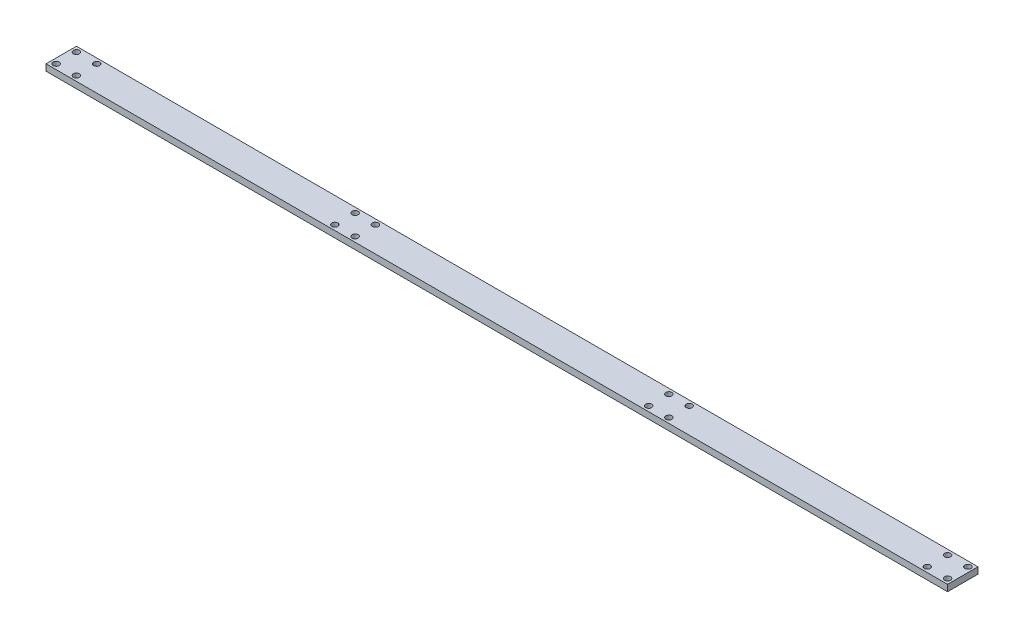
ISO-10303-21;
HEADER;
FILE_DESCRIPTION(('STEP AP214'),'2;1');
FILE_NAME('part.step','',(''),(''),'','','');
FILE_SCHEMA(('AUTOMOTIVE_DESIGN { 1 0 10303 214 1 1 1 1 }'));
ENDSEC;
DATA;
#1=APPLICATION_CONTEXT('core data for automotive mechanical design processes');
#2=APPLICATION_PROTOCOL_DEFINITION('international standard','automotive_design',2000,#1);
#3=PRODUCT_CONTEXT('',#1,'mechanical');
#4=PRODUCT('Part','Part','',(#3));
#5=PRODUCT_RELATED_PRODUCT_CATEGORY('part','',(#4));
#6=PRODUCT_DEFINITION_FORMATION('','',#4);
#7=PRODUCT_DEFINITION_CONTEXT('part definition',#1,'design');
#8=PRODUCT_DEFINITION('design','',#6,#7);
#9=PRODUCT_DEFINITION_SHAPE('','',#8);
#10=(LENGTH_UNIT() NAMED_UNIT(*) SI_UNIT(.MILLI.,.METRE.));
#11=(NAMED_UNIT(*) PLANE_ANGLE_UNIT() SI_UNIT($,.RADIAN.));
#12=(NAMED_UNIT(*) SI_UNIT($,.STERADIAN.) SOLID_ANGLE_UNIT());
#13=UNCERTAINTY_MEASURE_WITH_UNIT(LENGTH_MEASURE(1.E-05),#10,'distance_accuracy_value','');
#14=(GEOMETRIC_REPRESENTATION_CONTEXT(3) GLOBAL_UNCERTAINTY_ASSIGNED_CONTEXT((#13)) GLOBAL_UNIT_ASSIGNED_CONTEXT((#10,
#11,#12)) REPRESENTATION_CONTEXT('',''));
#15=CARTESIAN_POINT('',(0.,0.,0.));
#16=DIRECTION('',(0.,0.,1.));
#17=DIRECTION('',(1.,0.,0.));
#18=AXIS2_PLACEMENT_3D('',#15,#16,#17);
#19=CARTESIAN_POINT('',(0.,3.175,-15.));
#20=DIRECTION('',(0.,0.,-1.));
#21=DIRECTION('',(-1.,0.,0.));
#22=AXIS2_PLACEMENT_3D('',#19,#20,#21);
#23=PLANE('',#22);
#24=DIRECTION('',(1.,0.,0.));
#25=VECTOR('',#24,1.);
#26=CARTESIAN_POINT('',(0.,0.,-15.));
#27=LINE('',#26,#25);
#28=CARTESIAN_POINT('',(0.,0.,-15.));
#29=VERTEX_POINT('',#28);
#30=CARTESIAN_POINT('',(444.5,0.,-15.));
#31=VERTEX_POINT('',#30);
#32=EDGE_CURVE('E178',#29,#31,#27,.T.);
#33=ORIENTED_EDGE('',*,*,#32,.F.);
#34=DIRECTION('',(0.,-1.,0.));
#35=VECTOR('',#34,1.);
#36=CARTESIAN_POINT('',(0.,3.175,-15.));
#37=LINE('',#36,#35);
#38=CARTESIAN_POINT('',(0.,3.175,-15.));
#39=VERTEX_POINT('',#38);
#40=EDGE_CURVE('E11',#39,#29,#37,.T.);
#41=ORIENTED_EDGE('',*,*,#40,.F.);
#42=DIRECTION('',(1.,0.,0.));
#43=VECTOR('',#42,1.);
#44=CARTESIAN_POINT('',(0.,3.175,-15.));
#45=LINE('',#44,#43);
#46=CARTESIAN_POINT('',(444.5,3.175,-15.));
#47=VERTEX_POINT('',#46);
#48=EDGE_CURVE('E104',#39,#47,#45,.T.);
#49=ORIENTED_EDGE('',*,*,#48,.T.);
#50=DIRECTION('',(0.,-1.,0.));
#51=VECTOR('',#50,1.);
#52=CARTESIAN_POINT('',(444.5,3.175,-15.));
#53=LINE('',#52,#51);
#54=EDGE_CURVE('E80',#47,#31,#53,.T.);
#55=ORIENTED_EDGE('',*,*,#54,.T.);
#56=EDGE_LOOP('',(#33,#41,#49,#55));
#57=FACE_BOUND('',#56,.T.);
#58=ADVANCED_FACE('F39',(#57),#23,.T.);
#59=CARTESIAN_POINT('',(0.,3.175,0.));
#60=DIRECTION('',(-1.,0.,0.));
#61=DIRECTION('',(0.,0.,1.));
#62=AXIS2_PLACEMENT_3D('',#59,#60,#61);
#63=PLANE('',#62);
#64=DIRECTION('',(0.,0.,-1.));
#65=VECTOR('',#64,1.);
#66=CARTESIAN_POINT('',(0.,0.,0.));
#67=LINE('',#66,#65);
#68=CARTESIAN_POINT('',(0.,0.,0.));
#69=VERTEX_POINT('',#68);
#70=EDGE_CURVE('E92',#69,#29,#67,.T.);
#71=ORIENTED_EDGE('',*,*,#70,.F.);
#72=DIRECTION('',(0.,-1.,0.));
#73=VECTOR('',#72,1.);
#74=CARTESIAN_POINT('',(0.,3.175,0.));
#75=LINE('',#74,#73);
#76=CARTESIAN_POINT('',(0.,3.175,0.));
#77=VERTEX_POINT('',#76);
#78=EDGE_CURVE('E49',#77,#69,#75,.T.);
#79=ORIENTED_EDGE('',*,*,#78,.F.);
#80=DIRECTION('',(0.,0.,-1.));
#81=VECTOR('',#80,1.);
#82=CARTESIAN_POINT('',(0.,3.175,0.));
#83=LINE('',#82,#81);
#84=EDGE_CURVE('E90',#77,#39,#83,.T.);
#85=ORIENTED_EDGE('',*,*,#84,.T.);
#86=ORIENTED_EDGE('',*,*,#40,.T.);
#87=EDGE_LOOP('',(#71,#79,#85,#86));
#88=FACE_BOUND('',#87,.T.);
#89=ADVANCED_FACE('F88',(#88),#63,.T.);
#90=CARTESIAN_POINT('',(0.,3.175,0.));
#91=DIRECTION('',(0.,0.,-1.));
#92=DIRECTION('',(-1.,0.,0.));
#93=AXIS2_PLACEMENT_3D('',#90,#91,#92);
#94=PLANE('',#93);
#95=DIRECTION('',(1.,0.,0.));
#96=VECTOR('',#95,1.);
#97=CARTESIAN_POINT('',(0.,0.,0.));
#98=LINE('',#97,#96);
#99=CARTESIAN_POINT('',(444.5,0.,0.));
#100=VERTEX_POINT('',#99);
#101=EDGE_CURVE('E183',#69,#100,#98,.T.);
#102=ORIENTED_EDGE('',*,*,#101,.T.);
#103=DIRECTION('',(0.,-1.,0.));
#104=VECTOR('',#103,1.);
#105=CARTESIAN_POINT('',(444.5,3.175,0.));
#106=LINE('',#105,#104);
#107=CARTESIAN_POINT('',(444.5,3.175,0.));
#108=VERTEX_POINT('',#107);
#109=EDGE_CURVE('E96',#108,#100,#106,.T.);
#110=ORIENTED_EDGE('',*,*,#109,.F.);
#111=DIRECTION('',(1.,0.,0.));
#112=VECTOR('',#111,1.);
#113=CARTESIAN_POINT('',(0.,3.175,0.));
#114=LINE('',#113,#112);
#115=EDGE_CURVE('E98',#77,#108,#114,.T.);
#116=ORIENTED_EDGE('',*,*,#115,.F.);
#117=ORIENTED_EDGE('',*,*,#78,.T.);
#118=EDGE_LOOP('',(#102,#110,#116,#117));
#119=FACE_BOUND('',#118,.T.);
#120=ADVANCED_FACE('F99',(#119),#94,.F.);
#121=CARTESIAN_POINT('',(442.,3.175,-12.5));
#122=DIRECTION('',(0.,-1.,0.));
#123=DIRECTION('',(0.,0.,-1.));
#124=AXIS2_PLACEMENT_3D('',#121,#122,#123);
#125=CYLINDRICAL_SURFACE('',#124,1.49999999999997);
#126=CARTESIAN_POINT('',(442.,3.175,-12.5));
#127=DIRECTION('',(0.,1.,0.));
#128=DIRECTION('',(0.,0.,1.));
#129=AXIS2_PLACEMENT_3D('',#126,#127,#128);
#130=CIRCLE('',#129,1.49999999999997);
#131=CARTESIAN_POINT('',(442.,3.175,-11.));
#132=VERTEX_POINT('',#131);
#133=EDGE_CURVE('E154',#132,#132,#130,.F.);
#134=ORIENTED_EDGE('',*,*,#133,.F.);
#135=EDGE_LOOP('',(#134));
#136=FACE_BOUND('',#135,.T.);
#137=CARTESIAN_POINT('',(442.,0.,-12.5));
#138=DIRECTION('',(0.,1.,0.));
#139=DIRECTION('',(0.,0.,1.));
#140=AXIS2_PLACEMENT_3D('',#137,#138,#139);
#141=CIRCLE('',#140,1.49999999999997);
#142=CARTESIAN_POINT('',(442.,0.,-11.));
#143=VERTEX_POINT('',#142);
#144=EDGE_CURVE('E228',#143,#143,#141,.F.);
#145=ORIENTED_EDGE('',*,*,#144,.T.);
#146=EDGE_LOOP('',(#145));
#147=FACE_BOUND('',#146,.T.);
#148=ADVANCED_FACE('F291',(#136,#147),#125,.F.);
#149=CARTESIAN_POINT('',(432.,3.175,-12.5));
#150=DIRECTION('',(0.,-1.,0.));
#151=DIRECTION('',(0.,0.,-1.));
#152=AXIS2_PLACEMENT_3D('',#149,#150,#151);
#153=CYLINDRICAL_SURFACE('',#152,1.50000000000002);
#154=CARTESIAN_POINT('',(432.,3.175,-12.5));
#155=DIRECTION('',(0.,1.,0.));
#156=DIRECTION('',(0.,0.,1.));
#157=AXIS2_PLACEMENT_3D('',#154,#155,#156);
#158=CIRCLE('',#157,1.50000000000002);
#159=CARTESIAN_POINT('',(432.,3.175,-11.));
#160=VERTEX_POINT('',#159);
#161=EDGE_CURVE('E150',#160,#160,#158,.F.);
#162=ORIENTED_EDGE('',*,*,#161,.F.);
#163=EDGE_LOOP('',(#162));
#164=FACE_BOUND('',#163,.T.);
#165=CARTESIAN_POINT('',(432.,0.,-12.5));
#166=DIRECTION('',(0.,1.,0.));
#167=DIRECTION('',(0.,0.,1.));
#168=AXIS2_PLACEMENT_3D('',#165,#166,#167);
#169=CIRCLE('',#168,1.50000000000002);
#170=CARTESIAN_POINT('',(432.,0.,-11.));
#171=VERTEX_POINT('',#170);
#172=EDGE_CURVE('E224',#171,#171,#169,.F.);
#173=ORIENTED_EDGE('',*,*,#172,.T.);
#174=EDGE_LOOP('',(#173));
#175=FACE_BOUND('',#174,.T.);
#176=ADVANCED_FACE('F294',(#164,#175),#153,.F.);
#177=CARTESIAN_POINT('',(442.,3.175,-2.5));
#178=DIRECTION('',(0.,-1.,0.));
#179=DIRECTION('',(0.,0.,-1.));
#180=AXIS2_PLACEMENT_3D('',#177,#178,#179);
#181=CYLINDRICAL_SURFACE('',#180,1.49999999999997);
#182=CARTESIAN_POINT('',(442.,3.175,-2.5));
#183=DIRECTION('',(0.,1.,0.));
#184=DIRECTION('',(0.,0.,1.));
#185=AXIS2_PLACEMENT_3D('',#182,#183,#184);
#186=CIRCLE('',#185,1.49999999999997);
#187=CARTESIAN_POINT('',(442.,3.175,-1.00000000000003));
#188=VERTEX_POINT('',#187);
#189=EDGE_CURVE('E146',#188,#188,#186,.F.);
#190=ORIENTED_EDGE('',*,*,#189,.F.);
#191=EDGE_LOOP('',(#190));
#192=FACE_BOUND('',#191,.T.);
#193=CARTESIAN_POINT('',(442.,0.,-2.5));
#194=DIRECTION('',(0.,1.,0.));
#195=DIRECTION('',(0.,0.,1.));
#196=AXIS2_PLACEMENT_3D('',#193,#194,#195);
#197=CIRCLE('',#196,1.49999999999997);
#198=CARTESIAN_POINT('',(442.,0.,-1.00000000000003));
#199=VERTEX_POINT('',#198);
#200=EDGE_CURVE('E220',#199,#199,#197,.F.);
#201=ORIENTED_EDGE('',*,*,#200,.T.);
#202=EDGE_LOOP('',(#201));
#203=FACE_BOUND('',#202,.T.);
#204=ADVANCED_FACE('F298',(#192,#203),#181,.F.);
#205=CARTESIAN_POINT('',(294.6,3.175,-12.5));
#206=DIRECTION('',(0.,-1.,0.));
#207=DIRECTION('',(0.,0.,-1.));
#208=AXIS2_PLACEMENT_3D('',#205,#206,#207);
#209=CYLINDRICAL_SURFACE('',#208,1.49999999999997);
#210=CARTESIAN_POINT('',(294.6,3.175,-12.5));
#211=DIRECTION('',(0.,1.,0.));
#212=DIRECTION('',(0.,0.,1.));
#213=AXIS2_PLACEMENT_3D('',#210,#211,#212);
#214=CIRCLE('',#213,1.49999999999997);
#215=CARTESIAN_POINT('',(294.6,3.175,-11.));
#216=VERTEX_POINT('',#215);
#217=EDGE_CURVE('E142',#216,#216,#214,.T.);
#218=ORIENTED_EDGE('',*,*,#217,.T.);
#219=EDGE_LOOP('',(#218));
#220=FACE_BOUND('',#219,.T.);
#221=CARTESIAN_POINT('',(294.6,0.,-12.5));
#222=DIRECTION('',(0.,1.,0.));
#223=DIRECTION('',(0.,0.,1.));
#224=AXIS2_PLACEMENT_3D('',#221,#222,#223);
#225=CIRCLE('',#224,1.49999999999997);
#226=CARTESIAN_POINT('',(294.6,0.,-11.));
#227=VERTEX_POINT('',#226);
#228=EDGE_CURVE('E216',#227,#227,#225,.T.);
#229=ORIENTED_EDGE('',*,*,#228,.F.);
#230=EDGE_LOOP('',(#229));
#231=FACE_BOUND('',#230,.T.);
#232=ADVANCED_FACE('F302',(#220,#231),#209,.F.);
#233=CARTESIAN_POINT('',(304.6,3.175,-12.5));
#234=DIRECTION('',(0.,-1.,0.));
#235=DIRECTION('',(0.,0.,-1.));
#236=AXIS2_PLACEMENT_3D('',#233,#234,#235);
#237=CYLINDRICAL_SURFACE('',#236,1.50000000000002);
#238=CARTESIAN_POINT('',(304.6,3.175,-12.5));
#239=DIRECTION('',(0.,1.,0.));
#240=DIRECTION('',(0.,0.,1.));
#241=AXIS2_PLACEMENT_3D('',#238,#239,#240);
#242=CIRCLE('',#241,1.50000000000002);
#243=CARTESIAN_POINT('',(304.6,3.175,-11.));
#244=VERTEX_POINT('',#243);
#245=EDGE_CURVE('E138',#244,#244,#242,.T.);
#246=ORIENTED_EDGE('',*,*,#245,.T.);
#247=EDGE_LOOP('',(#246));
#248=FACE_BOUND('',#247,.T.);
#249=CARTESIAN_POINT('',(304.6,0.,-12.5));
#250=DIRECTION('',(0.,1.,0.));
#251=DIRECTION('',(0.,0.,1.));
#252=AXIS2_PLACEMENT_3D('',#249,#250,#251);
#253=CIRCLE('',#252,1.50000000000002);
#254=CARTESIAN_POINT('',(304.6,0.,-11.));
#255=VERTEX_POINT('',#254);
#256=EDGE_CURVE('E212',#255,#255,#253,.T.);
#257=ORIENTED_EDGE('',*,*,#256,.F.);
#258=EDGE_LOOP('',(#257));
#259=FACE_BOUND('',#258,.T.);
#260=ADVANCED_FACE('F306',(#248,#259),#237,.F.);
#261=CARTESIAN_POINT('',(304.6,3.175,-2.5));
#262=DIRECTION('',(0.,-1.,0.));
#263=DIRECTION('',(0.,0.,-1.));
#264=AXIS2_PLACEMENT_3D('',#261,#262,#263);
#265=CYLINDRICAL_SURFACE('',#264,1.50000000000002);
#266=CARTESIAN_POINT('',(304.6,3.175,-2.5));
#267=DIRECTION('',(0.,1.,0.));
#268=DIRECTION('',(0.,0.,1.));
#269=AXIS2_PLACEMENT_3D('',#266,#267,#268);
#270=CIRCLE('',#269,1.50000000000002);
#271=CARTESIAN_POINT('',(304.6,3.175,-0.999999999999976));
#272=VERTEX_POINT('',#271);
#273=EDGE_CURVE('E134',#272,#272,#270,.T.);
#274=ORIENTED_EDGE('',*,*,#273,.T.);
#275=EDGE_LOOP('',(#274));
#276=FACE_BOUND('',#275,.T.);
#277=CARTESIAN_POINT('',(304.6,0.,-2.5));
#278=DIRECTION('',(0.,1.,0.));
#279=DIRECTION('',(0.,0.,1.));
#280=AXIS2_PLACEMENT_3D('',#277,#278,#279);
#281=CIRCLE('',#280,1.50000000000002);
#282=CARTESIAN_POINT('',(304.6,0.,-0.999999999999976));
#283=VERTEX_POINT('',#282);
#284=EDGE_CURVE('E208',#283,#283,#281,.T.);
#285=ORIENTED_EDGE('',*,*,#284,.F.);
#286=EDGE_LOOP('',(#285));
#287=FACE_BOUND('',#286,.T.);
#288=ADVANCED_FACE('F310',(#276,#287),#265,.F.);
#289=CARTESIAN_POINT('',(294.6,3.175,-2.5));
#290=DIRECTION('',(0.,-1.,0.));
#291=DIRECTION('',(0.,0.,-1.));
#292=AXIS2_PLACEMENT_3D('',#289,#290,#291);
#293=CYLINDRICAL_SURFACE('',#292,1.49999999999997);
#294=CARTESIAN_POINT('',(294.6,3.175,-2.5));
#295=DIRECTION('',(0.,1.,0.));
#296=DIRECTION('',(0.,0.,1.));
#297=AXIS2_PLACEMENT_3D('',#294,#295,#296);
#298=CIRCLE('',#297,1.49999999999997);
#299=CARTESIAN_POINT('',(294.6,3.175,-1.00000000000003));
#300=VERTEX_POINT('',#299);
#301=EDGE_CURVE('E130',#300,#300,#298,.T.);
#302=ORIENTED_EDGE('',*,*,#301,.T.);
#303=EDGE_LOOP('',(#302));
#304=FACE_BOUND('',#303,.T.);
#305=CARTESIAN_POINT('',(294.6,0.,-2.5));
#306=DIRECTION('',(0.,1.,0.));
#307=DIRECTION('',(0.,0.,1.));
#308=AXIS2_PLACEMENT_3D('',#305,#306,#307);
#309=CIRCLE('',#308,1.49999999999997);
#310=CARTESIAN_POINT('',(294.6,0.,-1.00000000000003));
#311=VERTEX_POINT('',#310);
#312=EDGE_CURVE('E204',#311,#311,#309,.T.);
#313=ORIENTED_EDGE('',*,*,#312,.F.);
#314=EDGE_LOOP('',(#313));
#315=FACE_BOUND('',#314,.T.);
#316=ADVANCED_FACE('F314',(#304,#315),#293,.F.);
#317=CARTESIAN_POINT('',(139.9,3.175,-2.5));
#318=DIRECTION('',(0.,-1.,0.));
#319=DIRECTION('',(0.,0.,-1.));
#320=AXIS2_PLACEMENT_3D('',#317,#318,#319);
#321=CYLINDRICAL_SURFACE('',#320,1.50000000000002);
#322=CARTESIAN_POINT('',(139.9,3.175,-2.5));
#323=DIRECTION('',(0.,1.,0.));
#324=DIRECTION('',(0.,0.,1.));
#325=AXIS2_PLACEMENT_3D('',#322,#323,#324);
#326=CIRCLE('',#325,1.50000000000002);
#327=CARTESIAN_POINT('',(139.9,3.175,-0.999999999999976));
#328=VERTEX_POINT('',#327);
#329=EDGE_CURVE('E126',#328,#328,#326,.F.);
#330=ORIENTED_EDGE('',*,*,#329,.F.);
#331=EDGE_LOOP('',(#330));
#332=FACE_BOUND('',#331,.T.);
#333=CARTESIAN_POINT('',(139.9,0.,-2.5));
#334=DIRECTION('',(0.,1.,0.));
#335=DIRECTION('',(0.,0.,1.));
#336=AXIS2_PLACEMENT_3D('',#333,#334,#335);
#337=CIRCLE('',#336,1.50000000000002);
#338=CARTESIAN_POINT('',(139.9,0.,-0.999999999999976));
#339=VERTEX_POINT('',#338);
#340=EDGE_CURVE('E200',#339,#339,#337,.F.);
#341=ORIENTED_EDGE('',*,*,#340,.T.);
#342=EDGE_LOOP('',(#341));
#343=FACE_BOUND('',#342,.T.);
#344=ADVANCED_FACE('F318',(#332,#343),#321,.F.);
#345=CARTESIAN_POINT('',(139.9,3.175,-12.5));
#346=DIRECTION('',(0.,-1.,0.));
#347=DIRECTION('',(0.,0.,-1.));
#348=AXIS2_PLACEMENT_3D('',#345,#346,#347);
#349=CYLINDRICAL_SURFACE('',#348,1.50000000000002);
#350=CARTESIAN_POINT('',(139.9,3.175,-12.5));
#351=DIRECTION('',(0.,1.,0.));
#352=DIRECTION('',(0.,0.,1.));
#353=AXIS2_PLACEMENT_3D('',#350,#351,#352);
#354=CIRCLE('',#353,1.50000000000002);
#355=CARTESIAN_POINT('',(139.9,3.175,-11.));
#356=VERTEX_POINT('',#355);
#357=EDGE_CURVE('E122',#356,#356,#354,.F.);
#358=ORIENTED_EDGE('',*,*,#357,.F.);
#359=EDGE_LOOP('',(#358));
#360=FACE_BOUND('',#359,.T.);
#361=CARTESIAN_POINT('',(139.9,0.,-12.5));
#362=DIRECTION('',(0.,1.,0.));
#363=DIRECTION('',(0.,0.,1.));
#364=AXIS2_PLACEMENT_3D('',#361,#362,#363);
#365=CIRCLE('',#364,1.50000000000002);
#366=CARTESIAN_POINT('',(139.9,0.,-11.));
#367=VERTEX_POINT('',#366);
#368=EDGE_CURVE('E196',#367,#367,#365,.F.);
#369=ORIENTED_EDGE('',*,*,#368,.T.);
#370=EDGE_LOOP('',(#369));
#371=FACE_BOUND('',#370,.T.);
#372=ADVANCED_FACE('F322',(#360,#371),#349,.F.);
#373=CARTESIAN_POINT('',(149.9,3.175,-12.5));
#374=DIRECTION('',(0.,-1.,0.));
#375=DIRECTION('',(0.,0.,-1.));
#376=AXIS2_PLACEMENT_3D('',#373,#374,#375);
#377=CYLINDRICAL_SURFACE('',#376,1.5);
#378=CARTESIAN_POINT('',(149.9,3.175,-12.5));
#379=DIRECTION('',(0.,1.,0.));
#380=DIRECTION('',(0.,0.,1.));
#381=AXIS2_PLACEMENT_3D('',#378,#379,#380);
#382=CIRCLE('',#381,1.5);
#383=CARTESIAN_POINT('',(149.9,3.175,-11.));
#384=VERTEX_POINT('',#383);
#385=EDGE_CURVE('E118',#384,#384,#382,.F.);
#386=ORIENTED_EDGE('',*,*,#385,.F.);
#387=EDGE_LOOP('',(#386));
#388=FACE_BOUND('',#387,.T.);
#389=CARTESIAN_POINT('',(149.9,0.,-12.5));
#390=DIRECTION('',(0.,1.,0.));
#391=DIRECTION('',(0.,0.,1.));
#392=AXIS2_PLACEMENT_3D('',#389,#390,#391);
#393=CIRCLE('',#392,1.5);
#394=CARTESIAN_POINT('',(149.9,0.,-11.));
#395=VERTEX_POINT('',#394);
#396=EDGE_CURVE('E192',#395,#395,#393,.F.);
#397=ORIENTED_EDGE('',*,*,#396,.T.);
#398=EDGE_LOOP('',(#397));
#399=FACE_BOUND('',#398,.T.);
#400=ADVANCED_FACE('F326',(#388,#399),#377,.F.);
#401=CARTESIAN_POINT('',(149.9,3.175,-2.5));
#402=DIRECTION('',(0.,-1.,0.));
#403=DIRECTION('',(0.,0.,-1.));
#404=AXIS2_PLACEMENT_3D('',#401,#402,#403);
#405=CYLINDRICAL_SURFACE('',#404,1.5);
#406=CARTESIAN_POINT('',(149.9,3.175,-2.5));
#407=DIRECTION('',(0.,1.,0.));
#408=DIRECTION('',(0.,0.,1.));
#409=AXIS2_PLACEMENT_3D('',#406,#407,#408);
#410=CIRCLE('',#409,1.5);
#411=CARTESIAN_POINT('',(149.9,3.175,-1.));
#412=VERTEX_POINT('',#411);
#413=EDGE_CURVE('E114',#412,#412,#410,.F.);
#414=ORIENTED_EDGE('',*,*,#413,.F.);
#415=EDGE_LOOP('',(#414));
#416=FACE_BOUND('',#415,.T.);
#417=CARTESIAN_POINT('',(149.9,0.,-2.5));
#418=DIRECTION('',(0.,1.,0.));
#419=DIRECTION('',(0.,0.,1.));
#420=AXIS2_PLACEMENT_3D('',#417,#418,#419);
#421=CIRCLE('',#420,1.5);
#422=CARTESIAN_POINT('',(149.9,0.,-1.));
#423=VERTEX_POINT('',#422);
#424=EDGE_CURVE('E188',#423,#423,#421,.F.);
#425=ORIENTED_EDGE('',*,*,#424,.T.);
#426=EDGE_LOOP('',(#425));
#427=FACE_BOUND('',#426,.T.);
#428=ADVANCED_FACE('F330',(#416,#427),#405,.F.);
#429=CARTESIAN_POINT('',(444.5,3.175,0.));
#430=DIRECTION('',(-1.,0.,0.));
#431=DIRECTION('',(0.,0.,1.));
#432=AXIS2_PLACEMENT_3D('',#429,#430,#431);
#433=PLANE('',#432);
#434=DIRECTION('',(0.,0.,-1.));
#435=VECTOR('',#434,1.);
#436=CARTESIAN_POINT('',(444.5,0.,0.));
#437=LINE('',#436,#435);
#438=EDGE_CURVE('E73',#100,#31,#437,.T.);
#439=ORIENTED_EDGE('',*,*,#438,.T.);
#440=ORIENTED_EDGE('',*,*,#54,.F.);
#441=DIRECTION('',(0.,0.,-1.));
#442=VECTOR('',#441,1.);
#443=CARTESIAN_POINT('',(444.5,3.175,0.));
#444=LINE('',#443,#442);
#445=EDGE_CURVE('E57',#108,#47,#444,.T.);
#446=ORIENTED_EDGE('',*,*,#445,.F.);
#447=ORIENTED_EDGE('',*,*,#109,.T.);
#448=EDGE_LOOP('',(#439,#440,#446,#447));
#449=FACE_BOUND('',#448,.T.);
#450=ADVANCED_FACE('F241',(#449),#433,.F.);
#451=CARTESIAN_POINT('',(12.5,3.175,-12.5));
#452=DIRECTION('',(0.,-1.,0.));
#453=DIRECTION('',(0.,0.,-1.));
#454=AXIS2_PLACEMENT_3D('',#451,#452,#453);
#455=CYLINDRICAL_SURFACE('',#454,1.5);
#456=CARTESIAN_POINT('',(12.5,3.175,-12.5));
#457=DIRECTION('',(0.,1.,0.));
#458=DIRECTION('',(0.,0.,1.));
#459=AXIS2_PLACEMENT_3D('',#456,#457,#458);
#460=CIRCLE('',#459,1.5);
#461=CARTESIAN_POINT('',(12.5,3.175,-11.));
#462=VERTEX_POINT('',#461);
#463=EDGE_CURVE('E108',#462,#462,#460,.T.);
#464=ORIENTED_EDGE('',*,*,#463,.T.);
#465=EDGE_LOOP('',(#464));
#466=FACE_BOUND('',#465,.T.);
#467=CARTESIAN_POINT('',(12.5,0.,-12.5));
#468=DIRECTION('',(0.,1.,0.));
#469=DIRECTION('',(0.,0.,1.));
#470=AXIS2_PLACEMENT_3D('',#467,#468,#469);
#471=CIRCLE('',#470,1.5);
#472=CARTESIAN_POINT('',(12.5,0.,-11.));
#473=VERTEX_POINT('',#472);
#474=EDGE_CURVE('E174',#473,#473,#471,.T.);
#475=ORIENTED_EDGE('',*,*,#474,.F.);
#476=EDGE_LOOP('',(#475));
#477=FACE_BOUND('',#476,.T.);
#478=ADVANCED_FACE('F252',(#466,#477),#455,.F.);
#479=CARTESIAN_POINT('',(2.5,3.175,-12.5));
#480=DIRECTION('',(0.,-1.,0.));
#481=DIRECTION('',(0.,0.,-1.));
#482=AXIS2_PLACEMENT_3D('',#479,#480,#481);
#483=CYLINDRICAL_SURFACE('',#482,1.5);
#484=CARTESIAN_POINT('',(2.5,3.175,-12.5));
#485=DIRECTION('',(0.,1.,0.));
#486=DIRECTION('',(0.,0.,1.));
#487=AXIS2_PLACEMENT_3D('',#484,#485,#486);
#488=CIRCLE('',#487,1.5);
#489=CARTESIAN_POINT('',(2.5,3.175,-11.));
#490=VERTEX_POINT('',#489);
#491=EDGE_CURVE('E566',#490,#490,#488,.T.);
#492=ORIENTED_EDGE('',*,*,#491,.T.);
#493=EDGE_LOOP('',(#492));
#494=FACE_BOUND('',#493,.T.);
#495=CARTESIAN_POINT('',(2.5,0.,-12.5));
#496=DIRECTION('',(0.,1.,0.));
#497=DIRECTION('',(0.,0.,1.));
#498=AXIS2_PLACEMENT_3D('',#495,#496,#497);
#499=CIRCLE('',#498,1.5);
#500=CARTESIAN_POINT('',(2.5,0.,-11.));
#501=VERTEX_POINT('',#500);
#502=EDGE_CURVE('E170',#501,#501,#499,.T.);
#503=ORIENTED_EDGE('',*,*,#502,.F.);
#504=EDGE_LOOP('',(#503));
#505=FACE_BOUND('',#504,.T.);
#506=ADVANCED_FACE('F255',(#494,#505),#483,.F.);
#507=CARTESIAN_POINT('',(2.5,3.175,-2.5));
#508=DIRECTION('',(0.,-1.,0.));
#509=DIRECTION('',(0.,0.,-1.));
#510=AXIS2_PLACEMENT_3D('',#507,#508,#509);
#511=CYLINDRICAL_SURFACE('',#510,1.5);
#512=CARTESIAN_POINT('',(2.5,3.175,-2.5));
#513=DIRECTION('',(0.,1.,0.));
#514=DIRECTION('',(0.,0.,1.));
#515=AXIS2_PLACEMENT_3D('',#512,#513,#514);
#516=CIRCLE('',#515,1.5);
#517=CARTESIAN_POINT('',(2.5,3.175,-0.999999999999999));
#518=VERTEX_POINT('',#517);
#519=EDGE_CURVE('E270',#518,#518,#516,.T.);
#520=ORIENTED_EDGE('',*,*,#519,.T.);
#521=EDGE_LOOP('',(#520));
#522=FACE_BOUND('',#521,.T.);
#523=CARTESIAN_POINT('',(2.5,0.,-2.5));
#524=DIRECTION('',(0.,1.,0.));
#525=DIRECTION('',(0.,0.,1.));
#526=AXIS2_PLACEMENT_3D('',#523,#524,#525);
#527=CIRCLE('',#526,1.5);
#528=CARTESIAN_POINT('',(2.5,0.,-0.999999999999999));
#529=VERTEX_POINT('',#528);
#530=EDGE_CURVE('E166',#529,#529,#527,.T.);
#531=ORIENTED_EDGE('',*,*,#530,.F.);
#532=EDGE_LOOP('',(#531));
#533=FACE_BOUND('',#532,.T.);
#534=ADVANCED_FACE('F258',(#522,#533),#511,.F.);
#535=CARTESIAN_POINT('',(12.5,3.175,-2.5));
#536=DIRECTION('',(0.,-1.,0.));
#537=DIRECTION('',(0.,0.,-1.));
#538=AXIS2_PLACEMENT_3D('',#535,#536,#537);
#539=CYLINDRICAL_SURFACE('',#538,1.5);
#540=CARTESIAN_POINT('',(12.5,3.175,-2.5));
#541=DIRECTION('',(0.,1.,0.));
#542=DIRECTION('',(0.,0.,1.));
#543=AXIS2_PLACEMENT_3D('',#540,#541,#542);
#544=CIRCLE('',#543,1.5);
#545=CARTESIAN_POINT('',(12.5,3.175,-0.999999999999999));
#546=VERTEX_POINT('',#545);
#547=EDGE_CURVE('E236',#546,#546,#544,.T.);
#548=ORIENTED_EDGE('',*,*,#547,.T.);
#549=EDGE_LOOP('',(#548));
#550=FACE_BOUND('',#549,.T.);
#551=CARTESIAN_POINT('',(12.5,0.,-2.5));
#552=DIRECTION('',(0.,1.,0.));
#553=DIRECTION('',(0.,0.,1.));
#554=AXIS2_PLACEMENT_3D('',#551,#552,#553);
#555=CIRCLE('',#554,1.5);
#556=CARTESIAN_POINT('',(12.5,0.,-0.999999999999999));
#557=VERTEX_POINT('',#556);
#558=EDGE_CURVE('E162',#557,#557,#555,.T.);
#559=ORIENTED_EDGE('',*,*,#558,.F.);
#560=EDGE_LOOP('',(#559));
#561=FACE_BOUND('',#560,.T.);
#562=ADVANCED_FACE('F41',(#550,#561),#539,.F.);
#563=CARTESIAN_POINT('',(432.,3.175,-2.5));
#564=DIRECTION('',(0.,-1.,0.));
#565=DIRECTION('',(0.,0.,-1.));
#566=AXIS2_PLACEMENT_3D('',#563,#564,#565);
#567=CYLINDRICAL_SURFACE('',#566,1.50000000000002);
#568=CARTESIAN_POINT('',(432.,3.175,-2.5));
#569=DIRECTION('',(0.,1.,0.));
#570=DIRECTION('',(0.,0.,1.));
#571=AXIS2_PLACEMENT_3D('',#568,#569,#570);
#572=CIRCLE('',#571,1.50000000000002);
#573=CARTESIAN_POINT('',(432.,3.175,-0.999999999999976));
#574=VERTEX_POINT('',#573);
#575=EDGE_CURVE('E158',#574,#574,#572,.F.);
#576=ORIENTED_EDGE('',*,*,#575,.F.);
#577=EDGE_LOOP('',(#576));
#578=FACE_BOUND('',#577,.T.);
#579=CARTESIAN_POINT('',(432.,0.,-2.5));
#580=DIRECTION('',(0.,1.,0.));
#581=DIRECTION('',(0.,0.,1.));
#582=AXIS2_PLACEMENT_3D('',#579,#580,#581);
#583=CIRCLE('',#582,1.50000000000002);
#584=CARTESIAN_POINT('',(432.,0.,-0.999999999999976));
#585=VERTEX_POINT('',#584);
#586=EDGE_CURVE('E232',#585,#585,#583,.F.);
#587=ORIENTED_EDGE('',*,*,#586,.T.);
#588=EDGE_LOOP('',(#587));
#589=FACE_BOUND('',#588,.T.);
#590=ADVANCED_FACE('F265',(#578,#589),#567,.F.);
#591=CARTESIAN_POINT('',(0.,3.175,0.));
#592=DIRECTION('',(0.,1.,0.));
#593=DIRECTION('',(0.,0.,1.));
#594=AXIS2_PLACEMENT_3D('',#591,#592,#593);
#595=PLANE('',#594);
#596=ORIENTED_EDGE('',*,*,#547,.F.);
#597=EDGE_LOOP('',(#596));
#598=FACE_BOUND('',#597,.T.);
#599=ORIENTED_EDGE('',*,*,#519,.F.);
#600=EDGE_LOOP('',(#599));
#601=FACE_BOUND('',#600,.T.);
#602=ORIENTED_EDGE('',*,*,#491,.F.);
#603=EDGE_LOOP('',(#602));
#604=FACE_BOUND('',#603,.T.);
#605=ORIENTED_EDGE('',*,*,#463,.F.);
#606=EDGE_LOOP('',(#605));
#607=FACE_BOUND('',#606,.T.);
#608=ORIENTED_EDGE('',*,*,#48,.F.);
#609=ORIENTED_EDGE('',*,*,#84,.F.);
#610=ORIENTED_EDGE('',*,*,#115,.T.);
#611=ORIENTED_EDGE('',*,*,#445,.T.);
#612=EDGE_LOOP('',(#608,#609,#610,#611));
#613=FACE_BOUND('',#612,.T.);
#614=ORIENTED_EDGE('',*,*,#413,.T.);
#615=EDGE_LOOP('',(#614));
#616=FACE_BOUND('',#615,.T.);
#617=ORIENTED_EDGE('',*,*,#385,.T.);
#618=EDGE_LOOP('',(#617));
#619=FACE_BOUND('',#618,.T.);
#620=ORIENTED_EDGE('',*,*,#357,.T.);
#621=EDGE_LOOP('',(#620));
#622=FACE_BOUND('',#621,.T.);
#623=ORIENTED_EDGE('',*,*,#329,.T.);
#624=EDGE_LOOP('',(#623));
#625=FACE_BOUND('',#624,.T.);
#626=ORIENTED_EDGE('',*,*,#301,.F.);
#627=EDGE_LOOP('',(#626));
#628=FACE_BOUND('',#627,.T.);
#629=ORIENTED_EDGE('',*,*,#273,.F.);
#630=EDGE_LOOP('',(#629));
#631=FACE_BOUND('',#630,.T.);
#632=ORIENTED_EDGE('',*,*,#245,.F.);
#633=EDGE_LOOP('',(#632));
#634=FACE_BOUND('',#633,.T.);
#635=ORIENTED_EDGE('',*,*,#217,.F.);
#636=EDGE_LOOP('',(#635));
#637=FACE_BOUND('',#636,.T.);
#638=ORIENTED_EDGE('',*,*,#189,.T.);
#639=EDGE_LOOP('',(#638));
#640=FACE_BOUND('',#639,.T.);
#641=ORIENTED_EDGE('',*,*,#161,.T.);
#642=EDGE_LOOP('',(#641));
#643=FACE_BOUND('',#642,.T.);
#644=ORIENTED_EDGE('',*,*,#133,.T.);
#645=EDGE_LOOP('',(#644));
#646=FACE_BOUND('',#645,.T.);
#647=ORIENTED_EDGE('',*,*,#575,.T.);
#648=EDGE_LOOP('',(#647));
#649=FACE_BOUND('',#648,.T.);
#650=ADVANCED_FACE('F102',(#598,#601,#604,#607,#613,#616,#619,#622,#625,#628,#631,#634,#637,
#640,#643,#646,#649),#595,.T.);
#651=CARTESIAN_POINT('',(0.,0.,0.));
#652=DIRECTION('',(0.,1.,0.));
#653=DIRECTION('',(0.,0.,1.));
#654=AXIS2_PLACEMENT_3D('',#651,#652,#653);
#655=PLANE('',#654);
#656=ORIENTED_EDGE('',*,*,#558,.T.);
#657=EDGE_LOOP('',(#656));
#658=FACE_BOUND('',#657,.T.);
#659=ORIENTED_EDGE('',*,*,#530,.T.);
#660=EDGE_LOOP('',(#659));
#661=FACE_BOUND('',#660,.T.);
#662=ORIENTED_EDGE('',*,*,#502,.T.);
#663=EDGE_LOOP('',(#662));
#664=FACE_BOUND('',#663,.T.);
#665=ORIENTED_EDGE('',*,*,#474,.T.);
#666=EDGE_LOOP('',(#665));
#667=FACE_BOUND('',#666,.T.);
#668=ORIENTED_EDGE('',*,*,#32,.T.);
#669=ORIENTED_EDGE('',*,*,#438,.F.);
#670=ORIENTED_EDGE('',*,*,#101,.F.);
#671=ORIENTED_EDGE('',*,*,#70,.T.);
#672=EDGE_LOOP('',(#668,#669,#670,#671));
#673=FACE_BOUND('',#672,.T.);
#674=ORIENTED_EDGE('',*,*,#424,.F.);
#675=EDGE_LOOP('',(#674));
#676=FACE_BOUND('',#675,.T.);
#677=ORIENTED_EDGE('',*,*,#396,.F.);
#678=EDGE_LOOP('',(#677));
#679=FACE_BOUND('',#678,.T.);
#680=ORIENTED_EDGE('',*,*,#368,.F.);
#681=EDGE_LOOP('',(#680));
#682=FACE_BOUND('',#681,.T.);
#683=ORIENTED_EDGE('',*,*,#340,.F.);
#684=EDGE_LOOP('',(#683));
#685=FACE_BOUND('',#684,.T.);
#686=ORIENTED_EDGE('',*,*,#312,.T.);
#687=EDGE_LOOP('',(#686));
#688=FACE_BOUND('',#687,.T.);
#689=ORIENTED_EDGE('',*,*,#284,.T.);
#690=EDGE_LOOP('',(#689));
#691=FACE_BOUND('',#690,.T.);
#692=ORIENTED_EDGE('',*,*,#256,.T.);
#693=EDGE_LOOP('',(#692));
#694=FACE_BOUND('',#693,.T.);
#695=ORIENTED_EDGE('',*,*,#228,.T.);
#696=EDGE_LOOP('',(#695));
#697=FACE_BOUND('',#696,.T.);
#698=ORIENTED_EDGE('',*,*,#200,.F.);
#699=EDGE_LOOP('',(#698));
#700=FACE_BOUND('',#699,.T.);
#701=ORIENTED_EDGE('',*,*,#172,.F.);
#702=EDGE_LOOP('',(#701));
#703=FACE_BOUND('',#702,.T.);
#704=ORIENTED_EDGE('',*,*,#144,.F.);
#705=EDGE_LOOP('',(#704));
#706=FACE_BOUND('',#705,.T.);
#707=ORIENTED_EDGE('',*,*,#586,.F.);
#708=EDGE_LOOP('',(#707));
#709=FACE_BOUND('',#708,.T.);
#710=ADVANCED_FACE('F242',(#658,#661,#664,#667,#673,#676,#679,#682,#685,#688,#691,#694,#697,
#700,#703,#706,#709),#655,.F.);
#711=CLOSED_SHELL('',(#58,#89,#120,#148,#176,#204,#232,#260,#288,#316,#344,#372,#400,#428,#450,
#478,#506,#534,#562,#590,#650,#710));
#712=MANIFOLD_SOLID_BREP('B2',#711);
#713=ADVANCED_BREP_SHAPE_REPRESENTATION('',(#18,#712),#14);
#714=SHAPE_DEFINITION_REPRESENTATION(#9,#713);
ENDSEC;
END-ISO-10303-21;
